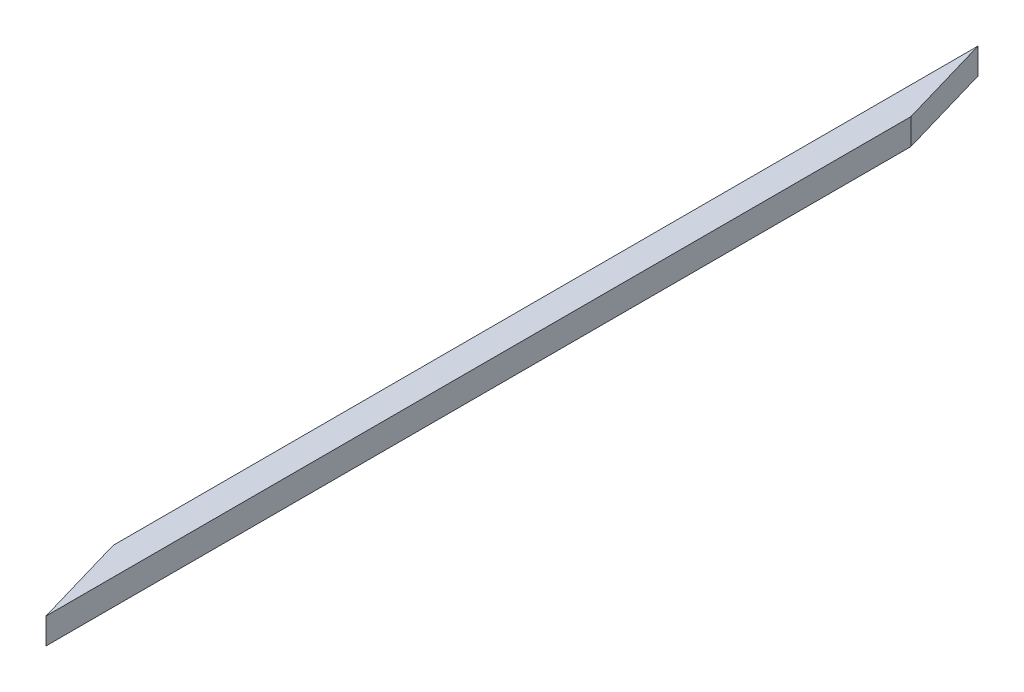
ISO-10303-21;
HEADER;
FILE_DESCRIPTION(('STEP AP214'),'2;1');
FILE_NAME('part.step','',(''),(''),'','','');
FILE_SCHEMA(('AUTOMOTIVE_DESIGN { 1 0 10303 214 1 1 1 1 }'));
ENDSEC;
DATA;
#1=APPLICATION_CONTEXT('core data for automotive mechanical design processes');
#2=APPLICATION_PROTOCOL_DEFINITION('international standard','automotive_design',2000,#1);
#3=PRODUCT_CONTEXT('',#1,'mechanical');
#4=PRODUCT('Part','Part','',(#3));
#5=PRODUCT_RELATED_PRODUCT_CATEGORY('part','',(#4));
#6=PRODUCT_DEFINITION_FORMATION('','',#4);
#7=PRODUCT_DEFINITION_CONTEXT('part definition',#1,'design');
#8=PRODUCT_DEFINITION('design','',#6,#7);
#9=PRODUCT_DEFINITION_SHAPE('','',#8);
#10=(LENGTH_UNIT() NAMED_UNIT(*) SI_UNIT(.MILLI.,.METRE.));
#11=(NAMED_UNIT(*) PLANE_ANGLE_UNIT() SI_UNIT($,.RADIAN.));
#12=(NAMED_UNIT(*) SI_UNIT($,.STERADIAN.) SOLID_ANGLE_UNIT());
#13=UNCERTAINTY_MEASURE_WITH_UNIT(LENGTH_MEASURE(1.E-05),#10,'distance_accuracy_value','');
#14=(GEOMETRIC_REPRESENTATION_CONTEXT(3) GLOBAL_UNCERTAINTY_ASSIGNED_CONTEXT((#13)) GLOBAL_UNIT_ASSIGNED_CONTEXT((#10,
#11,#12)) REPRESENTATION_CONTEXT('',''));
#15=CARTESIAN_POINT('',(0.,0.,0.));
#16=DIRECTION('',(0.,0.,1.));
#17=DIRECTION('',(1.,0.,0.));
#18=AXIS2_PLACEMENT_3D('',#15,#16,#17);
#19=CARTESIAN_POINT('',(-32.0224719101124,27.5280898876405,1737.37));
#20=DIRECTION('',(1.,0.,0.));
#21=DIRECTION('',(0.,0.,-1.));
#22=AXIS2_PLACEMENT_3D('',#19,#20,#21);
#23=PLANE('',#22);
#24=DIRECTION('',(0.,1.,0.));
#25=VECTOR('',#24,1.);
#26=CARTESIAN_POINT('',(-32.0224719101124,-22.4719101123595,1565.8146523949));
#27=LINE('',#26,#25);
#28=CARTESIAN_POINT('',(-32.0224719101124,-19.4719101123595,1565.8146523949));
#29=VERTEX_POINT('',#28);
#30=CARTESIAN_POINT('',(-32.0224719101124,27.5280898876405,1565.8146523949));
#31=VERTEX_POINT('',#30);
#32=EDGE_CURVE('E89',#29,#31,#27,.T.);
#33=ORIENTED_EDGE('',*,*,#32,.T.);
#34=DIRECTION('',(0.,0.,-1.));
#35=VECTOR('',#34,1.);
#36=CARTESIAN_POINT('',(-32.0224719101124,27.5280898876405,1737.37));
#37=LINE('',#36,#35);
#38=CARTESIAN_POINT('',(-32.0224719101124,27.5280898876405,0.));
#39=VERTEX_POINT('',#38);
#40=EDGE_CURVE('E85',#31,#39,#37,.T.);
#41=ORIENTED_EDGE('',*,*,#40,.T.);
#42=DIRECTION('',(0.,-1.,0.));
#43=VECTOR('',#42,1.);
#44=CARTESIAN_POINT('',(-32.0224719101124,27.5280898876405,0.));
#45=LINE('',#44,#43);
#46=CARTESIAN_POINT('',(-32.0224719101124,-19.4719101123595,0.));
#47=VERTEX_POINT('',#46);
#48=EDGE_CURVE('E68',#39,#47,#45,.T.);
#49=ORIENTED_EDGE('',*,*,#48,.T.);
#50=DIRECTION('',(0.,0.,-1.));
#51=VECTOR('',#50,1.);
#52=CARTESIAN_POINT('',(-32.0224719101124,-19.4719101123595,1737.37));
#53=LINE('',#52,#51);
#54=EDGE_CURVE('E11',#29,#47,#53,.T.);
#55=ORIENTED_EDGE('',*,*,#54,.F.);
#56=EDGE_LOOP('',(#33,#41,#49,#55));
#57=FACE_BOUND('',#56,.T.);
#58=ADVANCED_FACE('F33',(#57),#23,.F.);
#59=CARTESIAN_POINT('',(-32.0224719101124,-19.4719101123595,1737.37));
#60=DIRECTION('',(0.,1.,0.));
#61=DIRECTION('',(0.,0.,1.));
#62=AXIS2_PLACEMENT_3D('',#59,#60,#61);
#63=PLANE('',#62);
#64=ORIENTED_EDGE('',*,*,#54,.T.);
#65=DIRECTION('',(0.279726594287278,0.,0.960079701091759));
#66=VECTOR('',#65,1.);
#67=CARTESIAN_POINT('',(434.565311303554,-19.4719101123595,1601.42606598495));
#68=LINE('',#67,#66);
#69=CARTESIAN_POINT('',(17.9775280898876,-19.4719101123595,171.61037253858));
#70=VERTEX_POINT('',#69);
#71=EDGE_CURVE('E74',#47,#70,#68,.T.);
#72=ORIENTED_EDGE('',*,*,#71,.T.);
#73=DIRECTION('',(0.,0.,-1.));
#74=VECTOR('',#73,1.);
#75=CARTESIAN_POINT('',(17.9775280898876,-19.4719101123595,1737.37));
#76=LINE('',#75,#74);
#77=CARTESIAN_POINT('',(17.9775280898876,-19.4719101123595,1737.37));
#78=VERTEX_POINT('',#77);
#79=EDGE_CURVE('E41',#78,#70,#76,.T.);
#80=ORIENTED_EDGE('',*,*,#79,.F.);
#81=DIRECTION('',(0.279809290809963,0.,0.9600556029608));
#82=VECTOR('',#81,1.);
#83=CARTESIAN_POINT('',(14.0628661287089,-19.4719101123595,1723.93837612987));
#84=LINE('',#83,#82);
#85=EDGE_CURVE('E47',#29,#78,#84,.T.);
#86=ORIENTED_EDGE('',*,*,#85,.F.);
#87=EDGE_LOOP('',(#64,#72,#80,#86));
#88=FACE_BOUND('',#87,.T.);
#89=ADVANCED_FACE('F100',(#88),#63,.F.);
#90=CARTESIAN_POINT('',(-32.0224719101124,27.5280898876405,1737.37));
#91=DIRECTION('',(0.,-1.,0.));
#92=DIRECTION('',(0.,0.,-1.));
#93=AXIS2_PLACEMENT_3D('',#90,#91,#92);
#94=PLANE('',#93);
#95=DIRECTION('',(0.,0.,-1.));
#96=VECTOR('',#95,1.);
#97=CARTESIAN_POINT('',(17.9775280898876,27.5280898876405,1737.37));
#98=LINE('',#97,#96);
#99=CARTESIAN_POINT('',(17.9775280898876,27.5280898876405,1737.37));
#100=VERTEX_POINT('',#99);
#101=CARTESIAN_POINT('',(17.9775280898876,27.5280898876405,171.61037253858));
#102=VERTEX_POINT('',#101);
#103=EDGE_CURVE('E87',#100,#102,#98,.T.);
#104=ORIENTED_EDGE('',*,*,#103,.T.);
#105=DIRECTION('',(0.279726594287278,0.,0.960079701091759));
#106=VECTOR('',#105,1.);
#107=CARTESIAN_POINT('',(-29.5168105896411,27.5280898876405,8.59994945323174));
#108=LINE('',#107,#106);
#109=EDGE_CURVE('E71',#39,#102,#108,.T.);
#110=ORIENTED_EDGE('',*,*,#109,.F.);
#111=ORIENTED_EDGE('',*,*,#40,.F.);
#112=DIRECTION('',(0.279809290809963,0.,0.9600556029608));
#113=VECTOR('',#112,1.);
#114=CARTESIAN_POINT('',(-450.143998082446,27.5280898876405,131.194977121501));
#115=LINE('',#114,#113);
#116=EDGE_CURVE('E106',#31,#100,#115,.T.);
#117=ORIENTED_EDGE('',*,*,#116,.T.);
#118=EDGE_LOOP('',(#104,#110,#111,#117));
#119=FACE_BOUND('',#118,.T.);
#120=ADVANCED_FACE('F83',(#119),#94,.F.);
#121=CARTESIAN_POINT('',(17.9775280898876,27.5280898876405,1737.37));
#122=DIRECTION('',(-1.,0.,0.));
#123=DIRECTION('',(0.,-1.,0.));
#124=AXIS2_PLACEMENT_3D('',#121,#122,#123);
#125=PLANE('',#124);
#126=ORIENTED_EDGE('',*,*,#79,.T.);
#127=DIRECTION('',(0.,1.,0.));
#128=VECTOR('',#127,1.);
#129=CARTESIAN_POINT('',(17.9775280898876,-22.4719101123595,171.61037253858));
#130=LINE('',#129,#128);
#131=EDGE_CURVE('E88',#70,#102,#130,.T.);
#132=ORIENTED_EDGE('',*,*,#131,.T.);
#133=ORIENTED_EDGE('',*,*,#103,.F.);
#134=DIRECTION('',(0.,1.,0.));
#135=VECTOR('',#134,1.);
#136=CARTESIAN_POINT('',(17.9775280898876,27.5280898876405,1737.37));
#137=LINE('',#136,#135);
#138=EDGE_CURVE('E78',#78,#100,#137,.T.);
#139=ORIENTED_EDGE('',*,*,#138,.F.);
#140=EDGE_LOOP('',(#126,#132,#133,#139));
#141=FACE_BOUND('',#140,.T.);
#142=ADVANCED_FACE('F98',(#141),#125,.F.);
#143=CARTESIAN_POINT('',(-29.5168105896411,-22.4719101123595,8.59994945323174));
#144=DIRECTION('',(-0.960079701091759,0.,0.279726594287278));
#145=DIRECTION('',(0.279726594287278,0.,0.960079701091759));
#146=AXIS2_PLACEMENT_3D('',#143,#144,#145);
#147=PLANE('',#146);
#148=ORIENTED_EDGE('',*,*,#48,.F.);
#149=ORIENTED_EDGE('',*,*,#109,.T.);
#150=ORIENTED_EDGE('',*,*,#131,.F.);
#151=ORIENTED_EDGE('',*,*,#71,.F.);
#152=EDGE_LOOP('',(#148,#149,#150,#151));
#153=FACE_BOUND('',#152,.T.);
#154=ADVANCED_FACE('F70',(#153),#147,.F.);
#155=CARTESIAN_POINT('',(-450.143998082446,-22.4719101123595,131.194977121501));
#156=DIRECTION('',(-0.9600556029608,0.,0.279809290809963));
#157=DIRECTION('',(0.279809290809963,0.,0.9600556029608));
#158=AXIS2_PLACEMENT_3D('',#155,#156,#157);
#159=PLANE('',#158);
#160=ORIENTED_EDGE('',*,*,#85,.T.);
#161=ORIENTED_EDGE('',*,*,#138,.T.);
#162=ORIENTED_EDGE('',*,*,#116,.F.);
#163=ORIENTED_EDGE('',*,*,#32,.F.);
#164=EDGE_LOOP('',(#160,#161,#162,#163));
#165=FACE_BOUND('',#164,.T.);
#166=ADVANCED_FACE('F107',(#165),#159,.T.);
#167=CLOSED_SHELL('',(#58,#89,#120,#142,#154,#166));
#168=MANIFOLD_SOLID_BREP('B2',#167);
#169=ADVANCED_BREP_SHAPE_REPRESENTATION('',(#18,#168),#14);
#170=SHAPE_DEFINITION_REPRESENTATION(#9,#169);
ENDSEC;
END-ISO-10303-21;
